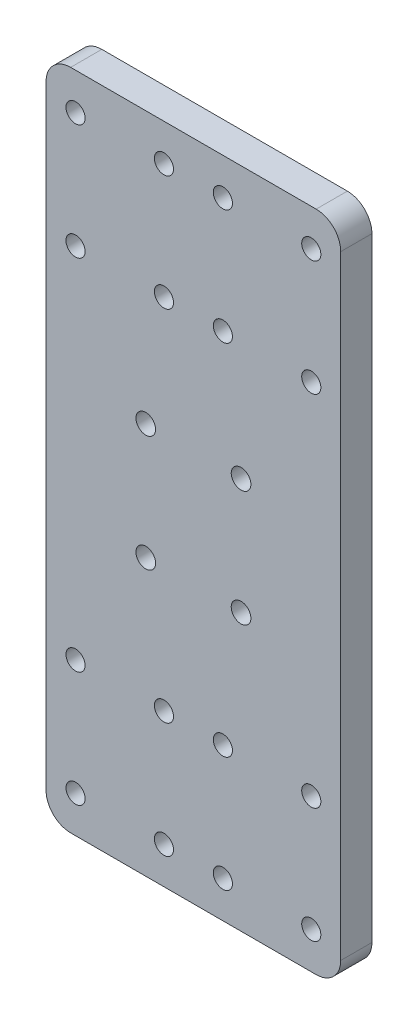
ISO-10303-21;
HEADER;
FILE_DESCRIPTION(('STEP AP214'),'2;1');
FILE_NAME('part.step','',(''),(''),'','','');
FILE_SCHEMA(('AUTOMOTIVE_DESIGN { 1 0 10303 214 1 1 1 1 }'));
ENDSEC;
DATA;
#1=APPLICATION_CONTEXT('core data for automotive mechanical design processes');
#2=APPLICATION_PROTOCOL_DEFINITION('international standard','automotive_design',2000,#1);
#3=PRODUCT_CONTEXT('',#1,'mechanical');
#4=PRODUCT('Part','Part','',(#3));
#5=PRODUCT_RELATED_PRODUCT_CATEGORY('part','',(#4));
#6=PRODUCT_DEFINITION_FORMATION('','',#4);
#7=PRODUCT_DEFINITION_CONTEXT('part definition',#1,'design');
#8=PRODUCT_DEFINITION('design','',#6,#7);
#9=PRODUCT_DEFINITION_SHAPE('','',#8);
#10=(LENGTH_UNIT() NAMED_UNIT(*) SI_UNIT(.MILLI.,.METRE.));
#11=(NAMED_UNIT(*) PLANE_ANGLE_UNIT() SI_UNIT($,.RADIAN.));
#12=(NAMED_UNIT(*) SI_UNIT($,.STERADIAN.) SOLID_ANGLE_UNIT());
#13=UNCERTAINTY_MEASURE_WITH_UNIT(LENGTH_MEASURE(1.E-05),#10,'distance_accuracy_value','');
#14=(GEOMETRIC_REPRESENTATION_CONTEXT(3) GLOBAL_UNCERTAINTY_ASSIGNED_CONTEXT((#13)) GLOBAL_UNIT_ASSIGNED_CONTEXT((#10,
#11,#12)) REPRESENTATION_CONTEXT('',''));
#15=CARTESIAN_POINT('',(0.,0.,0.));
#16=DIRECTION('',(0.,0.,1.));
#17=DIRECTION('',(1.,0.,0.));
#18=AXIS2_PLACEMENT_3D('',#15,#16,#17);
#19=CARTESIAN_POINT('',(-25.,-62.5,6.35));
#20=DIRECTION('',(0.,0.,-1.));
#21=DIRECTION('',(-1.,0.,0.));
#22=AXIS2_PLACEMENT_3D('',#19,#20,#21);
#23=PLANE('',#22);
#24=CARTESIAN_POINT('',(-25.,-62.5,6.35));
#25=DIRECTION('',(0.,0.,1.));
#26=DIRECTION('',(-1.,0.,0.));
#27=AXIS2_PLACEMENT_3D('',#24,#25,#26);
#28=CIRCLE('',#27,5.);
#29=CARTESIAN_POINT('',(-30.,-62.5,6.35));
#30=VERTEX_POINT('',#29);
#31=CARTESIAN_POINT('',(-25.,-67.5,6.35));
#32=VERTEX_POINT('',#31);
#33=EDGE_CURVE('E151',#30,#32,#28,.T.);
#34=ORIENTED_EDGE('',*,*,#33,.T.);
#35=DIRECTION('',(1.,0.,0.));
#36=VECTOR('',#35,1.);
#37=CARTESIAN_POINT('',(-25.,-67.5,6.35));
#38=LINE('',#37,#36);
#39=CARTESIAN_POINT('',(25.,-67.5,6.35));
#40=VERTEX_POINT('',#39);
#41=EDGE_CURVE('E99',#32,#40,#38,.T.);
#42=ORIENTED_EDGE('',*,*,#41,.T.);
#43=CARTESIAN_POINT('',(25.,-62.5,6.35));
#44=DIRECTION('',(0.,0.,1.));
#45=DIRECTION('',(1.,0.,0.));
#46=AXIS2_PLACEMENT_3D('',#43,#44,#45);
#47=CIRCLE('',#46,5.);
#48=CARTESIAN_POINT('',(30.,-62.5,6.35));
#49=VERTEX_POINT('',#48);
#50=EDGE_CURVE('E166',#40,#49,#47,.T.);
#51=ORIENTED_EDGE('',*,*,#50,.T.);
#52=DIRECTION('',(0.,1.,0.));
#53=VECTOR('',#52,1.);
#54=CARTESIAN_POINT('',(30.,-62.5,6.35));
#55=LINE('',#54,#53);
#56=CARTESIAN_POINT('',(30.,62.5,6.35));
#57=VERTEX_POINT('',#56);
#58=EDGE_CURVE('E179',#49,#57,#55,.T.);
#59=ORIENTED_EDGE('',*,*,#58,.T.);
#60=CARTESIAN_POINT('',(25.,62.5,6.35));
#61=DIRECTION('',(0.,0.,1.));
#62=DIRECTION('',(-1.,0.,0.));
#63=AXIS2_PLACEMENT_3D('',#60,#61,#62);
#64=CIRCLE('',#63,5.);
#65=CARTESIAN_POINT('',(25.,67.5,6.35));
#66=VERTEX_POINT('',#65);
#67=EDGE_CURVE('E118',#57,#66,#64,.T.);
#68=ORIENTED_EDGE('',*,*,#67,.T.);
#69=DIRECTION('',(-1.,0.,0.));
#70=VECTOR('',#69,1.);
#71=CARTESIAN_POINT('',(-25.,67.5,6.35));
#72=LINE('',#71,#70);
#73=CARTESIAN_POINT('',(-25.,67.5,6.35));
#74=VERTEX_POINT('',#73);
#75=EDGE_CURVE('E112',#66,#74,#72,.T.);
#76=ORIENTED_EDGE('',*,*,#75,.T.);
#77=CARTESIAN_POINT('',(-25.,62.5,6.35));
#78=DIRECTION('',(0.,0.,1.));
#79=DIRECTION('',(-1.,0.,0.));
#80=AXIS2_PLACEMENT_3D('',#77,#78,#79);
#81=CIRCLE('',#80,5.);
#82=CARTESIAN_POINT('',(-30.,62.5,6.35));
#83=VERTEX_POINT('',#82);
#84=EDGE_CURVE('E116',#74,#83,#81,.T.);
#85=ORIENTED_EDGE('',*,*,#84,.T.);
#86=DIRECTION('',(0.,-1.,0.));
#87=VECTOR('',#86,1.);
#88=CARTESIAN_POINT('',(-30.,-62.5,6.35));
#89=LINE('',#88,#87);
#90=EDGE_CURVE('E56',#83,#30,#89,.T.);
#91=ORIENTED_EDGE('',*,*,#90,.T.);
#92=EDGE_LOOP('',(#34,#42,#51,#59,#68,#76,#85,#91));
#93=FACE_BOUND('',#92,.T.);
#94=CARTESIAN_POINT('',(24.,60.,6.35));
#95=DIRECTION('',(0.,0.,1.));
#96=DIRECTION('',(1.,0.,0.));
#97=AXIS2_PLACEMENT_3D('',#94,#95,#96);
#98=CIRCLE('',#97,1.95);
#99=CARTESIAN_POINT('',(25.95,60.,6.35));
#100=VERTEX_POINT('',#99);
#101=EDGE_CURVE('E140',#100,#100,#98,.T.);
#102=ORIENTED_EDGE('',*,*,#101,.F.);
#103=EDGE_LOOP('',(#102));
#104=FACE_BOUND('',#103,.T.);
#105=CARTESIAN_POINT('',(6.,60.,6.35));
#106=DIRECTION('',(0.,0.,1.));
#107=DIRECTION('',(1.,0.,0.));
#108=AXIS2_PLACEMENT_3D('',#105,#106,#107);
#109=CIRCLE('',#108,1.95000000000001);
#110=CARTESIAN_POINT('',(7.95000000000001,60.,6.35));
#111=VERTEX_POINT('',#110);
#112=EDGE_CURVE('E188',#111,#111,#109,.T.);
#113=ORIENTED_EDGE('',*,*,#112,.F.);
#114=EDGE_LOOP('',(#113));
#115=FACE_BOUND('',#114,.T.);
#116=CARTESIAN_POINT('',(6.,36.5,6.35));
#117=DIRECTION('',(0.,0.,1.));
#118=DIRECTION('',(1.,0.,0.));
#119=AXIS2_PLACEMENT_3D('',#116,#117,#118);
#120=CIRCLE('',#119,1.95);
#121=CARTESIAN_POINT('',(7.95,36.5,6.35));
#122=VERTEX_POINT('',#121);
#123=EDGE_CURVE('E194',#122,#122,#120,.T.);
#124=ORIENTED_EDGE('',*,*,#123,.F.);
#125=EDGE_LOOP('',(#124));
#126=FACE_BOUND('',#125,.T.);
#127=CARTESIAN_POINT('',(24.,36.5,6.35));
#128=DIRECTION('',(0.,0.,1.));
#129=DIRECTION('',(1.,0.,0.));
#130=AXIS2_PLACEMENT_3D('',#127,#128,#129);
#131=CIRCLE('',#130,1.95);
#132=CARTESIAN_POINT('',(25.95,36.5,6.35));
#133=VERTEX_POINT('',#132);
#134=EDGE_CURVE('E200',#133,#133,#131,.T.);
#135=ORIENTED_EDGE('',*,*,#134,.F.);
#136=EDGE_LOOP('',(#135));
#137=FACE_BOUND('',#136,.T.);
#138=CARTESIAN_POINT('',(9.7,12.3,6.35));
#139=DIRECTION('',(0.,0.,1.));
#140=DIRECTION('',(1.,0.,0.));
#141=AXIS2_PLACEMENT_3D('',#138,#139,#140);
#142=CIRCLE('',#141,2.);
#143=CARTESIAN_POINT('',(11.7,12.3,6.35));
#144=VERTEX_POINT('',#143);
#145=EDGE_CURVE('E206',#144,#144,#142,.T.);
#146=ORIENTED_EDGE('',*,*,#145,.F.);
#147=EDGE_LOOP('',(#146));
#148=FACE_BOUND('',#147,.T.);
#149=CARTESIAN_POINT('',(-9.7,-11.3,6.35));
#150=DIRECTION('',(0.,0.,1.));
#151=DIRECTION('',(-1.,0.,0.));
#152=AXIS2_PLACEMENT_3D('',#149,#150,#151);
#153=CIRCLE('',#152,2.);
#154=CARTESIAN_POINT('',(-11.7,-11.3,6.35));
#155=VERTEX_POINT('',#154);
#156=EDGE_CURVE('E212',#155,#155,#153,.T.);
#157=ORIENTED_EDGE('',*,*,#156,.F.);
#158=EDGE_LOOP('',(#157));
#159=FACE_BOUND('',#158,.T.);
#160=CARTESIAN_POINT('',(-9.7,12.3,6.35));
#161=DIRECTION('',(0.,0.,1.));
#162=DIRECTION('',(-1.,0.,0.));
#163=AXIS2_PLACEMENT_3D('',#160,#161,#162);
#164=CIRCLE('',#163,2.);
#165=CARTESIAN_POINT('',(-11.7,12.3,6.35));
#166=VERTEX_POINT('',#165);
#167=EDGE_CURVE('E218',#166,#166,#164,.T.);
#168=ORIENTED_EDGE('',*,*,#167,.F.);
#169=EDGE_LOOP('',(#168));
#170=FACE_BOUND('',#169,.T.);
#171=CARTESIAN_POINT('',(-6.,60.,6.35));
#172=DIRECTION('',(0.,0.,1.));
#173=DIRECTION('',(-1.,0.,0.));
#174=AXIS2_PLACEMENT_3D('',#171,#172,#173);
#175=CIRCLE('',#174,1.95000000000001);
#176=CARTESIAN_POINT('',(-7.95000000000001,60.,6.35));
#177=VERTEX_POINT('',#176);
#178=EDGE_CURVE('E224',#177,#177,#175,.T.);
#179=ORIENTED_EDGE('',*,*,#178,.F.);
#180=EDGE_LOOP('',(#179));
#181=FACE_BOUND('',#180,.T.);
#182=CARTESIAN_POINT('',(-24.,60.,6.35));
#183=DIRECTION('',(0.,0.,1.));
#184=DIRECTION('',(-1.,0.,0.));
#185=AXIS2_PLACEMENT_3D('',#182,#183,#184);
#186=CIRCLE('',#185,1.95);
#187=CARTESIAN_POINT('',(-25.95,60.,6.35));
#188=VERTEX_POINT('',#187);
#189=EDGE_CURVE('E230',#188,#188,#186,.T.);
#190=ORIENTED_EDGE('',*,*,#189,.F.);
#191=EDGE_LOOP('',(#190));
#192=FACE_BOUND('',#191,.T.);
#193=CARTESIAN_POINT('',(-24.,36.5,6.35));
#194=DIRECTION('',(0.,0.,1.));
#195=DIRECTION('',(-1.,0.,0.));
#196=AXIS2_PLACEMENT_3D('',#193,#194,#195);
#197=CIRCLE('',#196,1.95);
#198=CARTESIAN_POINT('',(-25.95,36.5,6.35));
#199=VERTEX_POINT('',#198);
#200=EDGE_CURVE('E236',#199,#199,#197,.T.);
#201=ORIENTED_EDGE('',*,*,#200,.F.);
#202=EDGE_LOOP('',(#201));
#203=FACE_BOUND('',#202,.T.);
#204=CARTESIAN_POINT('',(-6.,36.5,6.35));
#205=DIRECTION('',(0.,0.,1.));
#206=DIRECTION('',(-1.,0.,0.));
#207=AXIS2_PLACEMENT_3D('',#204,#205,#206);
#208=CIRCLE('',#207,1.95);
#209=CARTESIAN_POINT('',(-7.95,36.5,6.35));
#210=VERTEX_POINT('',#209);
#211=EDGE_CURVE('E242',#210,#210,#208,.T.);
#212=ORIENTED_EDGE('',*,*,#211,.F.);
#213=EDGE_LOOP('',(#212));
#214=FACE_BOUND('',#213,.T.);
#215=CARTESIAN_POINT('',(-24.,-36.5,6.35));
#216=DIRECTION('',(0.,0.,1.));
#217=DIRECTION('',(1.,0.,0.));
#218=AXIS2_PLACEMENT_3D('',#215,#216,#217);
#219=CIRCLE('',#218,1.95);
#220=CARTESIAN_POINT('',(-22.05,-36.5,6.35));
#221=VERTEX_POINT('',#220);
#222=EDGE_CURVE('E248',#221,#221,#219,.T.);
#223=ORIENTED_EDGE('',*,*,#222,.F.);
#224=EDGE_LOOP('',(#223));
#225=FACE_BOUND('',#224,.T.);
#226=CARTESIAN_POINT('',(-6.,-36.5,6.35));
#227=DIRECTION('',(0.,0.,1.));
#228=DIRECTION('',(1.,0.,0.));
#229=AXIS2_PLACEMENT_3D('',#226,#227,#228);
#230=CIRCLE('',#229,1.95);
#231=CARTESIAN_POINT('',(-4.05,-36.5,6.35));
#232=VERTEX_POINT('',#231);
#233=EDGE_CURVE('E254',#232,#232,#230,.T.);
#234=ORIENTED_EDGE('',*,*,#233,.F.);
#235=EDGE_LOOP('',(#234));
#236=FACE_BOUND('',#235,.T.);
#237=CARTESIAN_POINT('',(6.,-36.5,6.35));
#238=DIRECTION('',(0.,0.,1.));
#239=DIRECTION('',(-1.,0.,0.));
#240=AXIS2_PLACEMENT_3D('',#237,#238,#239);
#241=CIRCLE('',#240,1.95);
#242=CARTESIAN_POINT('',(4.05,-36.5,6.35));
#243=VERTEX_POINT('',#242);
#244=EDGE_CURVE('E260',#243,#243,#241,.T.);
#245=ORIENTED_EDGE('',*,*,#244,.F.);
#246=EDGE_LOOP('',(#245));
#247=FACE_BOUND('',#246,.T.);
#248=CARTESIAN_POINT('',(24.,-36.5,6.35));
#249=DIRECTION('',(0.,0.,1.));
#250=DIRECTION('',(-1.,0.,0.));
#251=AXIS2_PLACEMENT_3D('',#248,#249,#250);
#252=CIRCLE('',#251,1.95);
#253=CARTESIAN_POINT('',(22.05,-36.5,6.35));
#254=VERTEX_POINT('',#253);
#255=EDGE_CURVE('E266',#254,#254,#252,.T.);
#256=ORIENTED_EDGE('',*,*,#255,.F.);
#257=EDGE_LOOP('',(#256));
#258=FACE_BOUND('',#257,.T.);
#259=CARTESIAN_POINT('',(24.,-60.,6.35));
#260=DIRECTION('',(0.,0.,1.));
#261=DIRECTION('',(-1.,0.,0.));
#262=AXIS2_PLACEMENT_3D('',#259,#260,#261);
#263=CIRCLE('',#262,1.95);
#264=CARTESIAN_POINT('',(22.05,-60.,6.35));
#265=VERTEX_POINT('',#264);
#266=EDGE_CURVE('E272',#265,#265,#263,.T.);
#267=ORIENTED_EDGE('',*,*,#266,.F.);
#268=EDGE_LOOP('',(#267));
#269=FACE_BOUND('',#268,.T.);
#270=CARTESIAN_POINT('',(6.,-60.,6.35));
#271=DIRECTION('',(0.,0.,1.));
#272=DIRECTION('',(-1.,0.,0.));
#273=AXIS2_PLACEMENT_3D('',#270,#271,#272);
#274=CIRCLE('',#273,1.95000000000001);
#275=CARTESIAN_POINT('',(4.05,-60.,6.35));
#276=VERTEX_POINT('',#275);
#277=EDGE_CURVE('E278',#276,#276,#274,.T.);
#278=ORIENTED_EDGE('',*,*,#277,.F.);
#279=EDGE_LOOP('',(#278));
#280=FACE_BOUND('',#279,.T.);
#281=CARTESIAN_POINT('',(-6.,-60.,6.35));
#282=DIRECTION('',(0.,0.,1.));
#283=DIRECTION('',(1.,0.,0.));
#284=AXIS2_PLACEMENT_3D('',#281,#282,#283);
#285=CIRCLE('',#284,1.95000000000001);
#286=CARTESIAN_POINT('',(-4.05,-60.,6.35));
#287=VERTEX_POINT('',#286);
#288=EDGE_CURVE('E284',#287,#287,#285,.T.);
#289=ORIENTED_EDGE('',*,*,#288,.F.);
#290=EDGE_LOOP('',(#289));
#291=FACE_BOUND('',#290,.T.);
#292=CARTESIAN_POINT('',(-24.,-60.,6.35));
#293=DIRECTION('',(0.,0.,1.));
#294=DIRECTION('',(1.,0.,0.));
#295=AXIS2_PLACEMENT_3D('',#292,#293,#294);
#296=CIRCLE('',#295,1.95);
#297=CARTESIAN_POINT('',(-22.05,-60.,6.35));
#298=VERTEX_POINT('',#297);
#299=EDGE_CURVE('E290',#298,#298,#296,.T.);
#300=ORIENTED_EDGE('',*,*,#299,.F.);
#301=EDGE_LOOP('',(#300));
#302=FACE_BOUND('',#301,.T.);
#303=CARTESIAN_POINT('',(9.7,-11.3,6.35));
#304=DIRECTION('',(0.,0.,1.));
#305=DIRECTION('',(1.,0.,0.));
#306=AXIS2_PLACEMENT_3D('',#303,#304,#305);
#307=CIRCLE('',#306,2.);
#308=CARTESIAN_POINT('',(11.7,-11.3,6.35));
#309=VERTEX_POINT('',#308);
#310=EDGE_CURVE('E296',#309,#309,#307,.T.);
#311=ORIENTED_EDGE('',*,*,#310,.F.);
#312=EDGE_LOOP('',(#311));
#313=FACE_BOUND('',#312,.T.);
#314=ADVANCED_FACE('F39',(#93,#104,#115,#126,#137,#148,#159,#170,#181,#192,#203,#214,#225,#236,
#247,#258,#269,#280,#291,#302,#313),#23,.F.);
#315=CARTESIAN_POINT('',(-25.,-62.5,0.));
#316=DIRECTION('',(0.,0.,-1.));
#317=DIRECTION('',(-1.,0.,0.));
#318=AXIS2_PLACEMENT_3D('',#315,#316,#317);
#319=PLANE('',#318);
#320=CARTESIAN_POINT('',(-24.,-60.,0.));
#321=DIRECTION('',(0.,0.,1.));
#322=DIRECTION('',(1.,0.,0.));
#323=AXIS2_PLACEMENT_3D('',#320,#321,#322);
#324=CIRCLE('',#323,1.95);
#325=CARTESIAN_POINT('',(-22.05,-60.,0.));
#326=VERTEX_POINT('',#325);
#327=EDGE_CURVE('E293',#326,#326,#324,.T.);
#328=ORIENTED_EDGE('',*,*,#327,.T.);
#329=EDGE_LOOP('',(#328));
#330=FACE_BOUND('',#329,.T.);
#331=CARTESIAN_POINT('',(6.,-60.,0.));
#332=DIRECTION('',(0.,0.,1.));
#333=DIRECTION('',(-1.,0.,0.));
#334=AXIS2_PLACEMENT_3D('',#331,#332,#333);
#335=CIRCLE('',#334,1.95000000000001);
#336=CARTESIAN_POINT('',(4.05,-60.,0.));
#337=VERTEX_POINT('',#336);
#338=EDGE_CURVE('E281',#337,#337,#335,.T.);
#339=ORIENTED_EDGE('',*,*,#338,.T.);
#340=EDGE_LOOP('',(#339));
#341=FACE_BOUND('',#340,.T.);
#342=CARTESIAN_POINT('',(24.,-36.5,0.));
#343=DIRECTION('',(0.,0.,1.));
#344=DIRECTION('',(-1.,0.,0.));
#345=AXIS2_PLACEMENT_3D('',#342,#343,#344);
#346=CIRCLE('',#345,1.95);
#347=CARTESIAN_POINT('',(22.05,-36.5,0.));
#348=VERTEX_POINT('',#347);
#349=EDGE_CURVE('E269',#348,#348,#346,.T.);
#350=ORIENTED_EDGE('',*,*,#349,.T.);
#351=EDGE_LOOP('',(#350));
#352=FACE_BOUND('',#351,.T.);
#353=CARTESIAN_POINT('',(-6.,-36.5,0.));
#354=DIRECTION('',(0.,0.,1.));
#355=DIRECTION('',(1.,0.,0.));
#356=AXIS2_PLACEMENT_3D('',#353,#354,#355);
#357=CIRCLE('',#356,1.95);
#358=CARTESIAN_POINT('',(-4.05,-36.5,0.));
#359=VERTEX_POINT('',#358);
#360=EDGE_CURVE('E257',#359,#359,#357,.T.);
#361=ORIENTED_EDGE('',*,*,#360,.T.);
#362=EDGE_LOOP('',(#361));
#363=FACE_BOUND('',#362,.T.);
#364=CARTESIAN_POINT('',(-6.,36.5,0.));
#365=DIRECTION('',(0.,0.,1.));
#366=DIRECTION('',(-1.,0.,0.));
#367=AXIS2_PLACEMENT_3D('',#364,#365,#366);
#368=CIRCLE('',#367,1.95);
#369=CARTESIAN_POINT('',(-7.95,36.5,0.));
#370=VERTEX_POINT('',#369);
#371=EDGE_CURVE('E245',#370,#370,#368,.T.);
#372=ORIENTED_EDGE('',*,*,#371,.T.);
#373=EDGE_LOOP('',(#372));
#374=FACE_BOUND('',#373,.T.);
#375=CARTESIAN_POINT('',(-24.,60.,0.));
#376=DIRECTION('',(0.,0.,1.));
#377=DIRECTION('',(-1.,0.,0.));
#378=AXIS2_PLACEMENT_3D('',#375,#376,#377);
#379=CIRCLE('',#378,1.95);
#380=CARTESIAN_POINT('',(-25.95,60.,0.));
#381=VERTEX_POINT('',#380);
#382=EDGE_CURVE('E233',#381,#381,#379,.T.);
#383=ORIENTED_EDGE('',*,*,#382,.T.);
#384=EDGE_LOOP('',(#383));
#385=FACE_BOUND('',#384,.T.);
#386=CARTESIAN_POINT('',(-9.7,12.3,0.));
#387=DIRECTION('',(0.,0.,1.));
#388=DIRECTION('',(-1.,0.,0.));
#389=AXIS2_PLACEMENT_3D('',#386,#387,#388);
#390=CIRCLE('',#389,2.);
#391=CARTESIAN_POINT('',(-11.7,12.3,0.));
#392=VERTEX_POINT('',#391);
#393=EDGE_CURVE('E221',#392,#392,#390,.T.);
#394=ORIENTED_EDGE('',*,*,#393,.T.);
#395=EDGE_LOOP('',(#394));
#396=FACE_BOUND('',#395,.T.);
#397=CARTESIAN_POINT('',(9.7,12.3,0.));
#398=DIRECTION('',(0.,0.,1.));
#399=DIRECTION('',(1.,0.,0.));
#400=AXIS2_PLACEMENT_3D('',#397,#398,#399);
#401=CIRCLE('',#400,2.);
#402=CARTESIAN_POINT('',(11.7,12.3,0.));
#403=VERTEX_POINT('',#402);
#404=EDGE_CURVE('E209',#403,#403,#401,.T.);
#405=ORIENTED_EDGE('',*,*,#404,.T.);
#406=EDGE_LOOP('',(#405));
#407=FACE_BOUND('',#406,.T.);
#408=CARTESIAN_POINT('',(6.,36.5,0.));
#409=DIRECTION('',(0.,0.,1.));
#410=DIRECTION('',(1.,0.,0.));
#411=AXIS2_PLACEMENT_3D('',#408,#409,#410);
#412=CIRCLE('',#411,1.95);
#413=CARTESIAN_POINT('',(7.95,36.5,0.));
#414=VERTEX_POINT('',#413);
#415=EDGE_CURVE('E197',#414,#414,#412,.T.);
#416=ORIENTED_EDGE('',*,*,#415,.T.);
#417=EDGE_LOOP('',(#416));
#418=FACE_BOUND('',#417,.T.);
#419=CARTESIAN_POINT('',(24.,60.,0.));
#420=DIRECTION('',(0.,0.,1.));
#421=DIRECTION('',(1.,0.,0.));
#422=AXIS2_PLACEMENT_3D('',#419,#420,#421);
#423=CIRCLE('',#422,1.95);
#424=CARTESIAN_POINT('',(25.95,60.,0.));
#425=VERTEX_POINT('',#424);
#426=EDGE_CURVE('E185',#425,#425,#423,.T.);
#427=ORIENTED_EDGE('',*,*,#426,.T.);
#428=EDGE_LOOP('',(#427));
#429=FACE_BOUND('',#428,.T.);
#430=CARTESIAN_POINT('',(-25.,-62.5,0.));
#431=DIRECTION('',(0.,0.,1.));
#432=DIRECTION('',(-1.,0.,0.));
#433=AXIS2_PLACEMENT_3D('',#430,#431,#432);
#434=CIRCLE('',#433,5.);
#435=CARTESIAN_POINT('',(-30.,-62.5,0.));
#436=VERTEX_POINT('',#435);
#437=CARTESIAN_POINT('',(-25.,-67.5,0.));
#438=VERTEX_POINT('',#437);
#439=EDGE_CURVE('E136',#436,#438,#434,.T.);
#440=ORIENTED_EDGE('',*,*,#439,.F.);
#441=DIRECTION('',(0.,-1.,0.));
#442=VECTOR('',#441,1.);
#443=CARTESIAN_POINT('',(-30.,-62.5,0.));
#444=LINE('',#443,#442);
#445=CARTESIAN_POINT('',(-30.,62.5,0.));
#446=VERTEX_POINT('',#445);
#447=EDGE_CURVE('E91',#446,#436,#444,.T.);
#448=ORIENTED_EDGE('',*,*,#447,.F.);
#449=CARTESIAN_POINT('',(-25.,62.5,0.));
#450=DIRECTION('',(0.,0.,1.));
#451=DIRECTION('',(-1.,0.,0.));
#452=AXIS2_PLACEMENT_3D('',#449,#450,#451);
#453=CIRCLE('',#452,5.);
#454=CARTESIAN_POINT('',(-25.,67.5,0.));
#455=VERTEX_POINT('',#454);
#456=EDGE_CURVE('E85',#455,#446,#453,.T.);
#457=ORIENTED_EDGE('',*,*,#456,.F.);
#458=DIRECTION('',(-1.,0.,0.));
#459=VECTOR('',#458,1.);
#460=CARTESIAN_POINT('',(-25.,67.5,0.));
#461=LINE('',#460,#459);
#462=CARTESIAN_POINT('',(25.,67.5,0.));
#463=VERTEX_POINT('',#462);
#464=EDGE_CURVE('E126',#463,#455,#461,.T.);
#465=ORIENTED_EDGE('',*,*,#464,.F.);
#466=CARTESIAN_POINT('',(25.,62.5,0.));
#467=DIRECTION('',(0.,0.,1.));
#468=DIRECTION('',(-1.,0.,0.));
#469=AXIS2_PLACEMENT_3D('',#466,#467,#468);
#470=CIRCLE('',#469,5.);
#471=CARTESIAN_POINT('',(30.,62.5,0.));
#472=VERTEX_POINT('',#471);
#473=EDGE_CURVE('E146',#472,#463,#470,.T.);
#474=ORIENTED_EDGE('',*,*,#473,.F.);
#475=DIRECTION('',(0.,1.,0.));
#476=VECTOR('',#475,1.);
#477=CARTESIAN_POINT('',(30.,-62.5,0.));
#478=LINE('',#477,#476);
#479=CARTESIAN_POINT('',(30.,-62.5,0.));
#480=VERTEX_POINT('',#479);
#481=EDGE_CURVE('E144',#480,#472,#478,.T.);
#482=ORIENTED_EDGE('',*,*,#481,.F.);
#483=CARTESIAN_POINT('',(25.,-62.5,0.));
#484=DIRECTION('',(0.,0.,1.));
#485=DIRECTION('',(1.,0.,0.));
#486=AXIS2_PLACEMENT_3D('',#483,#484,#485);
#487=CIRCLE('',#486,5.);
#488=CARTESIAN_POINT('',(25.,-67.5,0.));
#489=VERTEX_POINT('',#488);
#490=EDGE_CURVE('E142',#489,#480,#487,.T.);
#491=ORIENTED_EDGE('',*,*,#490,.F.);
#492=DIRECTION('',(1.,0.,0.));
#493=VECTOR('',#492,1.);
#494=CARTESIAN_POINT('',(-25.,-67.5,0.));
#495=LINE('',#494,#493);
#496=EDGE_CURVE('E139',#438,#489,#495,.T.);
#497=ORIENTED_EDGE('',*,*,#496,.F.);
#498=EDGE_LOOP('',(#440,#448,#457,#465,#474,#482,#491,#497));
#499=FACE_BOUND('',#498,.T.);
#500=CARTESIAN_POINT('',(6.,60.,0.));
#501=DIRECTION('',(0.,0.,1.));
#502=DIRECTION('',(1.,0.,0.));
#503=AXIS2_PLACEMENT_3D('',#500,#501,#502);
#504=CIRCLE('',#503,1.95000000000001);
#505=CARTESIAN_POINT('',(7.95000000000001,60.,0.));
#506=VERTEX_POINT('',#505);
#507=EDGE_CURVE('E191',#506,#506,#504,.T.);
#508=ORIENTED_EDGE('',*,*,#507,.T.);
#509=EDGE_LOOP('',(#508));
#510=FACE_BOUND('',#509,.T.);
#511=CARTESIAN_POINT('',(24.,36.5,0.));
#512=DIRECTION('',(0.,0.,1.));
#513=DIRECTION('',(1.,0.,0.));
#514=AXIS2_PLACEMENT_3D('',#511,#512,#513);
#515=CIRCLE('',#514,1.95);
#516=CARTESIAN_POINT('',(25.95,36.5,0.));
#517=VERTEX_POINT('',#516);
#518=EDGE_CURVE('E203',#517,#517,#515,.T.);
#519=ORIENTED_EDGE('',*,*,#518,.T.);
#520=EDGE_LOOP('',(#519));
#521=FACE_BOUND('',#520,.T.);
#522=CARTESIAN_POINT('',(-9.7,-11.3,0.));
#523=DIRECTION('',(0.,0.,1.));
#524=DIRECTION('',(-1.,0.,0.));
#525=AXIS2_PLACEMENT_3D('',#522,#523,#524);
#526=CIRCLE('',#525,2.);
#527=CARTESIAN_POINT('',(-11.7,-11.3,0.));
#528=VERTEX_POINT('',#527);
#529=EDGE_CURVE('E215',#528,#528,#526,.T.);
#530=ORIENTED_EDGE('',*,*,#529,.T.);
#531=EDGE_LOOP('',(#530));
#532=FACE_BOUND('',#531,.T.);
#533=CARTESIAN_POINT('',(-6.,60.,0.));
#534=DIRECTION('',(0.,0.,1.));
#535=DIRECTION('',(-1.,0.,0.));
#536=AXIS2_PLACEMENT_3D('',#533,#534,#535);
#537=CIRCLE('',#536,1.95000000000001);
#538=CARTESIAN_POINT('',(-7.95000000000001,60.,0.));
#539=VERTEX_POINT('',#538);
#540=EDGE_CURVE('E227',#539,#539,#537,.T.);
#541=ORIENTED_EDGE('',*,*,#540,.T.);
#542=EDGE_LOOP('',(#541));
#543=FACE_BOUND('',#542,.T.);
#544=CARTESIAN_POINT('',(-24.,36.5,0.));
#545=DIRECTION('',(0.,0.,1.));
#546=DIRECTION('',(-1.,0.,0.));
#547=AXIS2_PLACEMENT_3D('',#544,#545,#546);
#548=CIRCLE('',#547,1.95);
#549=CARTESIAN_POINT('',(-25.95,36.5,0.));
#550=VERTEX_POINT('',#549);
#551=EDGE_CURVE('E239',#550,#550,#548,.T.);
#552=ORIENTED_EDGE('',*,*,#551,.T.);
#553=EDGE_LOOP('',(#552));
#554=FACE_BOUND('',#553,.T.);
#555=CARTESIAN_POINT('',(-24.,-36.5,0.));
#556=DIRECTION('',(0.,0.,1.));
#557=DIRECTION('',(1.,0.,0.));
#558=AXIS2_PLACEMENT_3D('',#555,#556,#557);
#559=CIRCLE('',#558,1.95);
#560=CARTESIAN_POINT('',(-22.05,-36.5,0.));
#561=VERTEX_POINT('',#560);
#562=EDGE_CURVE('E251',#561,#561,#559,.T.);
#563=ORIENTED_EDGE('',*,*,#562,.T.);
#564=EDGE_LOOP('',(#563));
#565=FACE_BOUND('',#564,.T.);
#566=CARTESIAN_POINT('',(6.,-36.5,0.));
#567=DIRECTION('',(0.,0.,1.));
#568=DIRECTION('',(-1.,0.,0.));
#569=AXIS2_PLACEMENT_3D('',#566,#567,#568);
#570=CIRCLE('',#569,1.95);
#571=CARTESIAN_POINT('',(4.05,-36.5,0.));
#572=VERTEX_POINT('',#571);
#573=EDGE_CURVE('E263',#572,#572,#570,.T.);
#574=ORIENTED_EDGE('',*,*,#573,.T.);
#575=EDGE_LOOP('',(#574));
#576=FACE_BOUND('',#575,.T.);
#577=CARTESIAN_POINT('',(24.,-60.,0.));
#578=DIRECTION('',(0.,0.,1.));
#579=DIRECTION('',(-1.,0.,0.));
#580=AXIS2_PLACEMENT_3D('',#577,#578,#579);
#581=CIRCLE('',#580,1.95);
#582=CARTESIAN_POINT('',(22.05,-60.,0.));
#583=VERTEX_POINT('',#582);
#584=EDGE_CURVE('E275',#583,#583,#581,.T.);
#585=ORIENTED_EDGE('',*,*,#584,.T.);
#586=EDGE_LOOP('',(#585));
#587=FACE_BOUND('',#586,.T.);
#588=CARTESIAN_POINT('',(-6.,-60.,0.));
#589=DIRECTION('',(0.,0.,1.));
#590=DIRECTION('',(1.,0.,0.));
#591=AXIS2_PLACEMENT_3D('',#588,#589,#590);
#592=CIRCLE('',#591,1.95000000000001);
#593=CARTESIAN_POINT('',(-4.05,-60.,0.));
#594=VERTEX_POINT('',#593);
#595=EDGE_CURVE('E287',#594,#594,#592,.T.);
#596=ORIENTED_EDGE('',*,*,#595,.T.);
#597=EDGE_LOOP('',(#596));
#598=FACE_BOUND('',#597,.T.);
#599=CARTESIAN_POINT('',(9.7,-11.3,0.));
#600=DIRECTION('',(0.,0.,1.));
#601=DIRECTION('',(1.,0.,0.));
#602=AXIS2_PLACEMENT_3D('',#599,#600,#601);
#603=CIRCLE('',#602,2.);
#604=CARTESIAN_POINT('',(11.7,-11.3,0.));
#605=VERTEX_POINT('',#604);
#606=EDGE_CURVE('E299',#605,#605,#603,.T.);
#607=ORIENTED_EDGE('',*,*,#606,.T.);
#608=EDGE_LOOP('',(#607));
#609=FACE_BOUND('',#608,.T.);
#610=ADVANCED_FACE('F170',(#330,#341,#352,#363,#374,#385,#396,#407,#418,#429,#499,#510,#521,
#532,#543,#554,#565,#576,#587,#598,#609),#319,.T.);
#611=CARTESIAN_POINT('',(-25.,-62.5,6.35));
#612=DIRECTION('',(0.,0.,-1.));
#613=DIRECTION('',(-1.,0.,0.));
#614=AXIS2_PLACEMENT_3D('',#611,#612,#613);
#615=CYLINDRICAL_SURFACE('',#614,5.);
#616=ORIENTED_EDGE('',*,*,#439,.T.);
#617=DIRECTION('',(0.,0.,-1.));
#618=VECTOR('',#617,1.);
#619=CARTESIAN_POINT('',(-25.,-67.5,6.35));
#620=LINE('',#619,#618);
#621=EDGE_CURVE('E11',#32,#438,#620,.T.);
#622=ORIENTED_EDGE('',*,*,#621,.F.);
#623=ORIENTED_EDGE('',*,*,#33,.F.);
#624=DIRECTION('',(0.,0.,-1.));
#625=VECTOR('',#624,1.);
#626=CARTESIAN_POINT('',(-30.,-62.5,6.35));
#627=LINE('',#626,#625);
#628=EDGE_CURVE('E132',#30,#436,#627,.T.);
#629=ORIENTED_EDGE('',*,*,#628,.T.);
#630=EDGE_LOOP('',(#616,#622,#623,#629));
#631=FACE_BOUND('',#630,.T.);
#632=ADVANCED_FACE('F41',(#631),#615,.T.);
#633=CARTESIAN_POINT('',(-25.,-67.5,6.35));
#634=DIRECTION('',(0.,1.,0.));
#635=DIRECTION('',(0.,0.,1.));
#636=AXIS2_PLACEMENT_3D('',#633,#634,#635);
#637=PLANE('',#636);
#638=ORIENTED_EDGE('',*,*,#496,.T.);
#639=DIRECTION('',(0.,0.,-1.));
#640=VECTOR('',#639,1.);
#641=CARTESIAN_POINT('',(25.,-67.5,6.35));
#642=LINE('',#641,#640);
#643=EDGE_CURVE('E48',#40,#489,#642,.T.);
#644=ORIENTED_EDGE('',*,*,#643,.F.);
#645=ORIENTED_EDGE('',*,*,#41,.F.);
#646=ORIENTED_EDGE('',*,*,#621,.T.);
#647=EDGE_LOOP('',(#638,#644,#645,#646));
#648=FACE_BOUND('',#647,.T.);
#649=ADVANCED_FACE('F331',(#648),#637,.F.);
#650=CARTESIAN_POINT('',(25.,-62.5,6.35));
#651=DIRECTION('',(0.,0.,-1.));
#652=DIRECTION('',(-1.,0.,0.));
#653=AXIS2_PLACEMENT_3D('',#650,#651,#652);
#654=CYLINDRICAL_SURFACE('',#653,5.);
#655=ORIENTED_EDGE('',*,*,#490,.T.);
#656=DIRECTION('',(0.,0.,-1.));
#657=VECTOR('',#656,1.);
#658=CARTESIAN_POINT('',(30.,-62.5,6.35));
#659=LINE('',#658,#657);
#660=EDGE_CURVE('E158',#49,#480,#659,.T.);
#661=ORIENTED_EDGE('',*,*,#660,.F.);
#662=ORIENTED_EDGE('',*,*,#50,.F.);
#663=ORIENTED_EDGE('',*,*,#643,.T.);
#664=EDGE_LOOP('',(#655,#661,#662,#663));
#665=FACE_BOUND('',#664,.T.);
#666=ADVANCED_FACE('F164',(#665),#654,.T.);
#667=CARTESIAN_POINT('',(30.,-62.5,6.35));
#668=DIRECTION('',(-1.,0.,0.));
#669=DIRECTION('',(0.,0.,1.));
#670=AXIS2_PLACEMENT_3D('',#667,#668,#669);
#671=PLANE('',#670);
#672=ORIENTED_EDGE('',*,*,#481,.T.);
#673=DIRECTION('',(0.,0.,-1.));
#674=VECTOR('',#673,1.);
#675=CARTESIAN_POINT('',(30.,62.5,6.35));
#676=LINE('',#675,#674);
#677=EDGE_CURVE('E155',#57,#472,#676,.T.);
#678=ORIENTED_EDGE('',*,*,#677,.F.);
#679=ORIENTED_EDGE('',*,*,#58,.F.);
#680=ORIENTED_EDGE('',*,*,#660,.T.);
#681=EDGE_LOOP('',(#672,#678,#679,#680));
#682=FACE_BOUND('',#681,.T.);
#683=ADVANCED_FACE('F175',(#682),#671,.F.);
#684=CARTESIAN_POINT('',(25.,62.5,6.35));
#685=DIRECTION('',(0.,0.,-1.));
#686=DIRECTION('',(-1.,0.,0.));
#687=AXIS2_PLACEMENT_3D('',#684,#685,#686);
#688=CYLINDRICAL_SURFACE('',#687,5.);
#689=ORIENTED_EDGE('',*,*,#473,.T.);
#690=DIRECTION('',(0.,0.,-1.));
#691=VECTOR('',#690,1.);
#692=CARTESIAN_POINT('',(25.,67.5,6.35));
#693=LINE('',#692,#691);
#694=EDGE_CURVE('E127',#66,#463,#693,.T.);
#695=ORIENTED_EDGE('',*,*,#694,.F.);
#696=ORIENTED_EDGE('',*,*,#67,.F.);
#697=ORIENTED_EDGE('',*,*,#677,.T.);
#698=EDGE_LOOP('',(#689,#695,#696,#697));
#699=FACE_BOUND('',#698,.T.);
#700=ADVANCED_FACE('F178',(#699),#688,.T.);
#701=CARTESIAN_POINT('',(-25.,67.5,6.35));
#702=DIRECTION('',(0.,-1.,0.));
#703=DIRECTION('',(0.,0.,-1.));
#704=AXIS2_PLACEMENT_3D('',#701,#702,#703);
#705=PLANE('',#704);
#706=ORIENTED_EDGE('',*,*,#464,.T.);
#707=DIRECTION('',(0.,0.,-1.));
#708=VECTOR('',#707,1.);
#709=CARTESIAN_POINT('',(-25.,67.5,6.35));
#710=LINE('',#709,#708);
#711=EDGE_CURVE('E123',#74,#455,#710,.T.);
#712=ORIENTED_EDGE('',*,*,#711,.F.);
#713=ORIENTED_EDGE('',*,*,#75,.F.);
#714=ORIENTED_EDGE('',*,*,#694,.T.);
#715=EDGE_LOOP('',(#706,#712,#713,#714));
#716=FACE_BOUND('',#715,.T.);
#717=ADVANCED_FACE('F124',(#716),#705,.F.);
#718=CARTESIAN_POINT('',(-25.,62.5,6.35));
#719=DIRECTION('',(0.,0.,-1.));
#720=DIRECTION('',(-1.,0.,0.));
#721=AXIS2_PLACEMENT_3D('',#718,#719,#720);
#722=CYLINDRICAL_SURFACE('',#721,5.);
#723=ORIENTED_EDGE('',*,*,#456,.T.);
#724=DIRECTION('',(0.,0.,-1.));
#725=VECTOR('',#724,1.);
#726=CARTESIAN_POINT('',(-30.,62.5,6.35));
#727=LINE('',#726,#725);
#728=EDGE_CURVE('E128',#83,#446,#727,.T.);
#729=ORIENTED_EDGE('',*,*,#728,.F.);
#730=ORIENTED_EDGE('',*,*,#84,.F.);
#731=ORIENTED_EDGE('',*,*,#711,.T.);
#732=EDGE_LOOP('',(#723,#729,#730,#731));
#733=FACE_BOUND('',#732,.T.);
#734=ADVANCED_FACE('F130',(#733),#722,.T.);
#735=CARTESIAN_POINT('',(-30.,-62.5,6.35));
#736=DIRECTION('',(1.,0.,0.));
#737=DIRECTION('',(0.,1.,0.));
#738=AXIS2_PLACEMENT_3D('',#735,#736,#737);
#739=PLANE('',#738);
#740=ORIENTED_EDGE('',*,*,#447,.T.);
#741=ORIENTED_EDGE('',*,*,#628,.F.);
#742=ORIENTED_EDGE('',*,*,#90,.F.);
#743=ORIENTED_EDGE('',*,*,#728,.T.);
#744=EDGE_LOOP('',(#740,#741,#742,#743));
#745=FACE_BOUND('',#744,.T.);
#746=ADVANCED_FACE('F319',(#745),#739,.F.);
#747=CARTESIAN_POINT('',(24.,60.,6.35));
#748=DIRECTION('',(0.,0.,-1.));
#749=DIRECTION('',(-1.,0.,0.));
#750=AXIS2_PLACEMENT_3D('',#747,#748,#749);
#751=CYLINDRICAL_SURFACE('',#750,1.95);
#752=ORIENTED_EDGE('',*,*,#101,.T.);
#753=EDGE_LOOP('',(#752));
#754=FACE_BOUND('',#753,.T.);
#755=ORIENTED_EDGE('',*,*,#426,.F.);
#756=EDGE_LOOP('',(#755));
#757=FACE_BOUND('',#756,.T.);
#758=ADVANCED_FACE('F316',(#754,#757),#751,.F.);
#759=CARTESIAN_POINT('',(6.,60.,6.35));
#760=DIRECTION('',(0.,0.,-1.));
#761=DIRECTION('',(-1.,0.,0.));
#762=AXIS2_PLACEMENT_3D('',#759,#760,#761);
#763=CYLINDRICAL_SURFACE('',#762,1.95000000000001);
#764=ORIENTED_EDGE('',*,*,#112,.T.);
#765=EDGE_LOOP('',(#764));
#766=FACE_BOUND('',#765,.T.);
#767=ORIENTED_EDGE('',*,*,#507,.F.);
#768=EDGE_LOOP('',(#767));
#769=FACE_BOUND('',#768,.T.);
#770=ADVANCED_FACE('F429',(#766,#769),#763,.F.);
#771=CARTESIAN_POINT('',(6.,36.5,6.35));
#772=DIRECTION('',(0.,0.,-1.));
#773=DIRECTION('',(-1.,0.,0.));
#774=AXIS2_PLACEMENT_3D('',#771,#772,#773);
#775=CYLINDRICAL_SURFACE('',#774,1.95);
#776=ORIENTED_EDGE('',*,*,#123,.T.);
#777=EDGE_LOOP('',(#776));
#778=FACE_BOUND('',#777,.T.);
#779=ORIENTED_EDGE('',*,*,#415,.F.);
#780=EDGE_LOOP('',(#779));
#781=FACE_BOUND('',#780,.T.);
#782=ADVANCED_FACE('F440',(#778,#781),#775,.F.);
#783=CARTESIAN_POINT('',(24.,36.5,6.35));
#784=DIRECTION('',(0.,0.,-1.));
#785=DIRECTION('',(-1.,0.,0.));
#786=AXIS2_PLACEMENT_3D('',#783,#784,#785);
#787=CYLINDRICAL_SURFACE('',#786,1.95);
#788=ORIENTED_EDGE('',*,*,#134,.T.);
#789=EDGE_LOOP('',(#788));
#790=FACE_BOUND('',#789,.T.);
#791=ORIENTED_EDGE('',*,*,#518,.F.);
#792=EDGE_LOOP('',(#791));
#793=FACE_BOUND('',#792,.T.);
#794=ADVANCED_FACE('F451',(#790,#793),#787,.F.);
#795=CARTESIAN_POINT('',(9.7,12.3,6.35));
#796=DIRECTION('',(0.,0.,-1.));
#797=DIRECTION('',(-1.,0.,0.));
#798=AXIS2_PLACEMENT_3D('',#795,#796,#797);
#799=CYLINDRICAL_SURFACE('',#798,2.);
#800=ORIENTED_EDGE('',*,*,#145,.T.);
#801=EDGE_LOOP('',(#800));
#802=FACE_BOUND('',#801,.T.);
#803=ORIENTED_EDGE('',*,*,#404,.F.);
#804=EDGE_LOOP('',(#803));
#805=FACE_BOUND('',#804,.T.);
#806=ADVANCED_FACE('F463',(#802,#805),#799,.F.);
#807=CARTESIAN_POINT('',(-9.7,-11.3,6.35));
#808=DIRECTION('',(0.,0.,-1.));
#809=DIRECTION('',(-1.,0.,0.));
#810=AXIS2_PLACEMENT_3D('',#807,#808,#809);
#811=CYLINDRICAL_SURFACE('',#810,2.);
#812=ORIENTED_EDGE('',*,*,#156,.T.);
#813=EDGE_LOOP('',(#812));
#814=FACE_BOUND('',#813,.T.);
#815=ORIENTED_EDGE('',*,*,#529,.F.);
#816=EDGE_LOOP('',(#815));
#817=FACE_BOUND('',#816,.T.);
#818=ADVANCED_FACE('F475',(#814,#817),#811,.F.);
#819=CARTESIAN_POINT('',(-9.7,12.3,6.35));
#820=DIRECTION('',(0.,0.,-1.));
#821=DIRECTION('',(-1.,0.,0.));
#822=AXIS2_PLACEMENT_3D('',#819,#820,#821);
#823=CYLINDRICAL_SURFACE('',#822,2.);
#824=ORIENTED_EDGE('',*,*,#167,.T.);
#825=EDGE_LOOP('',(#824));
#826=FACE_BOUND('',#825,.T.);
#827=ORIENTED_EDGE('',*,*,#393,.F.);
#828=EDGE_LOOP('',(#827));
#829=FACE_BOUND('',#828,.T.);
#830=ADVANCED_FACE('F487',(#826,#829),#823,.F.);
#831=CARTESIAN_POINT('',(-6.,60.,6.35));
#832=DIRECTION('',(0.,0.,-1.));
#833=DIRECTION('',(-1.,0.,0.));
#834=AXIS2_PLACEMENT_3D('',#831,#832,#833);
#835=CYLINDRICAL_SURFACE('',#834,1.95000000000001);
#836=ORIENTED_EDGE('',*,*,#178,.T.);
#837=EDGE_LOOP('',(#836));
#838=FACE_BOUND('',#837,.T.);
#839=ORIENTED_EDGE('',*,*,#540,.F.);
#840=EDGE_LOOP('',(#839));
#841=FACE_BOUND('',#840,.T.);
#842=ADVANCED_FACE('F499',(#838,#841),#835,.F.);
#843=CARTESIAN_POINT('',(-24.,60.,6.35));
#844=DIRECTION('',(0.,0.,-1.));
#845=DIRECTION('',(-1.,0.,0.));
#846=AXIS2_PLACEMENT_3D('',#843,#844,#845);
#847=CYLINDRICAL_SURFACE('',#846,1.95);
#848=ORIENTED_EDGE('',*,*,#189,.T.);
#849=EDGE_LOOP('',(#848));
#850=FACE_BOUND('',#849,.T.);
#851=ORIENTED_EDGE('',*,*,#382,.F.);
#852=EDGE_LOOP('',(#851));
#853=FACE_BOUND('',#852,.T.);
#854=ADVANCED_FACE('F511',(#850,#853),#847,.F.);
#855=CARTESIAN_POINT('',(-24.,36.5,6.35));
#856=DIRECTION('',(0.,0.,-1.));
#857=DIRECTION('',(-1.,0.,0.));
#858=AXIS2_PLACEMENT_3D('',#855,#856,#857);
#859=CYLINDRICAL_SURFACE('',#858,1.95);
#860=ORIENTED_EDGE('',*,*,#200,.T.);
#861=EDGE_LOOP('',(#860));
#862=FACE_BOUND('',#861,.T.);
#863=ORIENTED_EDGE('',*,*,#551,.F.);
#864=EDGE_LOOP('',(#863));
#865=FACE_BOUND('',#864,.T.);
#866=ADVANCED_FACE('F523',(#862,#865),#859,.F.);
#867=CARTESIAN_POINT('',(-6.,36.5,6.35));
#868=DIRECTION('',(0.,0.,-1.));
#869=DIRECTION('',(-1.,0.,0.));
#870=AXIS2_PLACEMENT_3D('',#867,#868,#869);
#871=CYLINDRICAL_SURFACE('',#870,1.95);
#872=ORIENTED_EDGE('',*,*,#211,.T.);
#873=EDGE_LOOP('',(#872));
#874=FACE_BOUND('',#873,.T.);
#875=ORIENTED_EDGE('',*,*,#371,.F.);
#876=EDGE_LOOP('',(#875));
#877=FACE_BOUND('',#876,.T.);
#878=ADVANCED_FACE('F535',(#874,#877),#871,.F.);
#879=CARTESIAN_POINT('',(-24.,-36.5,6.35));
#880=DIRECTION('',(0.,0.,-1.));
#881=DIRECTION('',(-1.,0.,0.));
#882=AXIS2_PLACEMENT_3D('',#879,#880,#881);
#883=CYLINDRICAL_SURFACE('',#882,1.95);
#884=ORIENTED_EDGE('',*,*,#222,.T.);
#885=EDGE_LOOP('',(#884));
#886=FACE_BOUND('',#885,.T.);
#887=ORIENTED_EDGE('',*,*,#562,.F.);
#888=EDGE_LOOP('',(#887));
#889=FACE_BOUND('',#888,.T.);
#890=ADVANCED_FACE('F547',(#886,#889),#883,.F.);
#891=CARTESIAN_POINT('',(-6.,-36.5,6.35));
#892=DIRECTION('',(0.,0.,-1.));
#893=DIRECTION('',(-1.,0.,0.));
#894=AXIS2_PLACEMENT_3D('',#891,#892,#893);
#895=CYLINDRICAL_SURFACE('',#894,1.95);
#896=ORIENTED_EDGE('',*,*,#233,.T.);
#897=EDGE_LOOP('',(#896));
#898=FACE_BOUND('',#897,.T.);
#899=ORIENTED_EDGE('',*,*,#360,.F.);
#900=EDGE_LOOP('',(#899));
#901=FACE_BOUND('',#900,.T.);
#902=ADVANCED_FACE('F559',(#898,#901),#895,.F.);
#903=CARTESIAN_POINT('',(6.,-36.5,6.35));
#904=DIRECTION('',(0.,0.,-1.));
#905=DIRECTION('',(-1.,0.,0.));
#906=AXIS2_PLACEMENT_3D('',#903,#904,#905);
#907=CYLINDRICAL_SURFACE('',#906,1.95);
#908=ORIENTED_EDGE('',*,*,#244,.T.);
#909=EDGE_LOOP('',(#908));
#910=FACE_BOUND('',#909,.T.);
#911=ORIENTED_EDGE('',*,*,#573,.F.);
#912=EDGE_LOOP('',(#911));
#913=FACE_BOUND('',#912,.T.);
#914=ADVANCED_FACE('F571',(#910,#913),#907,.F.);
#915=CARTESIAN_POINT('',(24.,-36.5,6.35));
#916=DIRECTION('',(0.,0.,-1.));
#917=DIRECTION('',(-1.,0.,0.));
#918=AXIS2_PLACEMENT_3D('',#915,#916,#917);
#919=CYLINDRICAL_SURFACE('',#918,1.95);
#920=ORIENTED_EDGE('',*,*,#255,.T.);
#921=EDGE_LOOP('',(#920));
#922=FACE_BOUND('',#921,.T.);
#923=ORIENTED_EDGE('',*,*,#349,.F.);
#924=EDGE_LOOP('',(#923));
#925=FACE_BOUND('',#924,.T.);
#926=ADVANCED_FACE('F583',(#922,#925),#919,.F.);
#927=CARTESIAN_POINT('',(24.,-60.,6.35));
#928=DIRECTION('',(0.,0.,-1.));
#929=DIRECTION('',(-1.,0.,0.));
#930=AXIS2_PLACEMENT_3D('',#927,#928,#929);
#931=CYLINDRICAL_SURFACE('',#930,1.95);
#932=ORIENTED_EDGE('',*,*,#266,.T.);
#933=EDGE_LOOP('',(#932));
#934=FACE_BOUND('',#933,.T.);
#935=ORIENTED_EDGE('',*,*,#584,.F.);
#936=EDGE_LOOP('',(#935));
#937=FACE_BOUND('',#936,.T.);
#938=ADVANCED_FACE('F595',(#934,#937),#931,.F.);
#939=CARTESIAN_POINT('',(6.,-60.,6.35));
#940=DIRECTION('',(0.,0.,-1.));
#941=DIRECTION('',(-1.,0.,0.));
#942=AXIS2_PLACEMENT_3D('',#939,#940,#941);
#943=CYLINDRICAL_SURFACE('',#942,1.95000000000001);
#944=ORIENTED_EDGE('',*,*,#277,.T.);
#945=EDGE_LOOP('',(#944));
#946=FACE_BOUND('',#945,.T.);
#947=ORIENTED_EDGE('',*,*,#338,.F.);
#948=EDGE_LOOP('',(#947));
#949=FACE_BOUND('',#948,.T.);
#950=ADVANCED_FACE('F607',(#946,#949),#943,.F.);
#951=CARTESIAN_POINT('',(-6.,-60.,6.35));
#952=DIRECTION('',(0.,0.,-1.));
#953=DIRECTION('',(-1.,0.,0.));
#954=AXIS2_PLACEMENT_3D('',#951,#952,#953);
#955=CYLINDRICAL_SURFACE('',#954,1.95000000000001);
#956=ORIENTED_EDGE('',*,*,#288,.T.);
#957=EDGE_LOOP('',(#956));
#958=FACE_BOUND('',#957,.T.);
#959=ORIENTED_EDGE('',*,*,#595,.F.);
#960=EDGE_LOOP('',(#959));
#961=FACE_BOUND('',#960,.T.);
#962=ADVANCED_FACE('F619',(#958,#961),#955,.F.);
#963=CARTESIAN_POINT('',(-24.,-60.,6.35));
#964=DIRECTION('',(0.,0.,-1.));
#965=DIRECTION('',(-1.,0.,0.));
#966=AXIS2_PLACEMENT_3D('',#963,#964,#965);
#967=CYLINDRICAL_SURFACE('',#966,1.95);
#968=ORIENTED_EDGE('',*,*,#299,.T.);
#969=EDGE_LOOP('',(#968));
#970=FACE_BOUND('',#969,.T.);
#971=ORIENTED_EDGE('',*,*,#327,.F.);
#972=EDGE_LOOP('',(#971));
#973=FACE_BOUND('',#972,.T.);
#974=ADVANCED_FACE('F631',(#970,#973),#967,.F.);
#975=CARTESIAN_POINT('',(9.7,-11.3,6.35));
#976=DIRECTION('',(0.,0.,-1.));
#977=DIRECTION('',(-1.,0.,0.));
#978=AXIS2_PLACEMENT_3D('',#975,#976,#977);
#979=CYLINDRICAL_SURFACE('',#978,2.);
#980=ORIENTED_EDGE('',*,*,#310,.T.);
#981=EDGE_LOOP('',(#980));
#982=FACE_BOUND('',#981,.T.);
#983=ORIENTED_EDGE('',*,*,#606,.F.);
#984=EDGE_LOOP('',(#983));
#985=FACE_BOUND('',#984,.T.);
#986=ADVANCED_FACE('F305',(#982,#985),#979,.F.);
#987=CLOSED_SHELL('',(#314,#610,#632,#649,#666,#683,#700,#717,#734,#746,#758,#770,#782,#794,
#806,#818,#830,#842,#854,#866,#878,#890,#902,#914,#926,#938,#950,#962,#974,#986));
#988=MANIFOLD_SOLID_BREP('B2',#987);
#989=ADVANCED_BREP_SHAPE_REPRESENTATION('',(#18,#988),#14);
#990=SHAPE_DEFINITION_REPRESENTATION(#9,#989);
ENDSEC;
END-ISO-10303-21;
